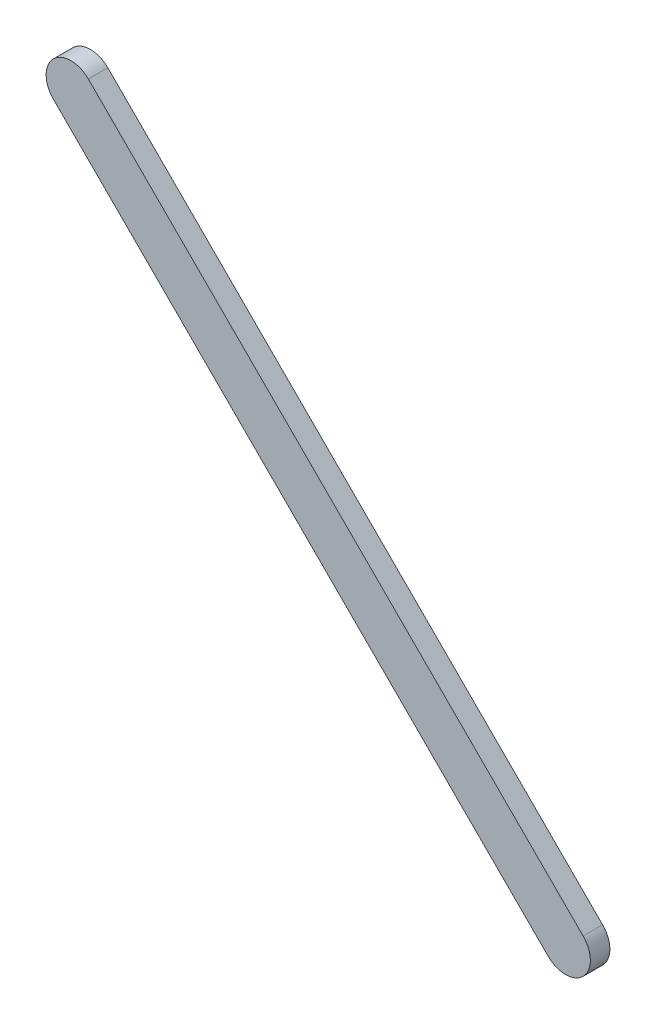
ISO-10303-21;
HEADER;
FILE_DESCRIPTION(('STEP AP214'),'2;1');
FILE_NAME('part.step','',(''),(''),'','','');
FILE_SCHEMA(('AUTOMOTIVE_DESIGN { 1 0 10303 214 1 1 1 1 }'));
ENDSEC;
DATA;
#1=APPLICATION_CONTEXT('core data for automotive mechanical design processes');
#2=APPLICATION_PROTOCOL_DEFINITION('international standard','automotive_design',2000,#1);
#3=PRODUCT_CONTEXT('',#1,'mechanical');
#4=PRODUCT('Part','Part','',(#3));
#5=PRODUCT_RELATED_PRODUCT_CATEGORY('part','',(#4));
#6=PRODUCT_DEFINITION_FORMATION('','',#4);
#7=PRODUCT_DEFINITION_CONTEXT('part definition',#1,'design');
#8=PRODUCT_DEFINITION('design','',#6,#7);
#9=PRODUCT_DEFINITION_SHAPE('','',#8);
#10=(LENGTH_UNIT() NAMED_UNIT(*) SI_UNIT(.MILLI.,.METRE.));
#11=(NAMED_UNIT(*) PLANE_ANGLE_UNIT() SI_UNIT($,.RADIAN.));
#12=(NAMED_UNIT(*) SI_UNIT($,.STERADIAN.) SOLID_ANGLE_UNIT());
#13=UNCERTAINTY_MEASURE_WITH_UNIT(LENGTH_MEASURE(1.E-05),#10,'distance_accuracy_value','');
#14=(GEOMETRIC_REPRESENTATION_CONTEXT(3) GLOBAL_UNCERTAINTY_ASSIGNED_CONTEXT((#13)) GLOBAL_UNIT_ASSIGNED_CONTEXT((#10,
#11,#12)) REPRESENTATION_CONTEXT('',''));
#15=CARTESIAN_POINT('',(0.,0.,0.));
#16=DIRECTION('',(0.,0.,1.));
#17=DIRECTION('',(1.,0.,0.));
#18=AXIS2_PLACEMENT_3D('',#15,#16,#17);
#19=CARTESIAN_POINT('',(129.58899406,118.7177966,0.));
#20=DIRECTION('',(0.707106781186546,0.70710678118655,0.));
#21=DIRECTION('',(0.70710678118655,-0.707106781186546,0.));
#22=AXIS2_PLACEMENT_3D('',#19,#20,#21);
#23=PLANE('',#22);
#24=DIRECTION('',(0.70710678118655,-0.707106781186546,0.));
#25=VECTOR('',#24,1.);
#26=CARTESIAN_POINT('',(129.58899406,118.7177966,0.1999996));
#27=LINE('',#26,#25);
#28=CARTESIAN_POINT('',(129.58899406,118.7177966,0.1999996));
#29=VERTEX_POINT('',#28);
#30=CARTESIAN_POINT('',(134.6689966,113.63779406,0.1999996));
#31=VERTEX_POINT('',#30);
#32=EDGE_CURVE('E11',#29,#31,#27,.T.);
#33=ORIENTED_EDGE('',*,*,#32,.F.);
#34=DIRECTION('',(0.,0.,1.));
#35=VECTOR('',#34,1.);
#36=CARTESIAN_POINT('',(129.58899406,118.7177966,0.));
#37=LINE('',#36,#35);
#38=CARTESIAN_POINT('',(129.58899406,118.7177966,0.));
#39=VERTEX_POINT('',#38);
#40=EDGE_CURVE('E24',#39,#29,#37,.T.);
#41=ORIENTED_EDGE('',*,*,#40,.F.);
#42=DIRECTION('',(0.70710678118655,-0.707106781186546,0.));
#43=VECTOR('',#42,1.);
#44=CARTESIAN_POINT('',(129.58899406,118.7177966,0.));
#45=LINE('',#44,#43);
#46=CARTESIAN_POINT('',(134.6689966,113.63779406,0.));
#47=VERTEX_POINT('',#46);
#48=EDGE_CURVE('E75',#39,#47,#45,.T.);
#49=ORIENTED_EDGE('',*,*,#48,.T.);
#50=DIRECTION('',(0.,0.,1.));
#51=VECTOR('',#50,1.);
#52=CARTESIAN_POINT('',(134.6689966,113.63779406,0.));
#53=LINE('',#52,#51);
#54=EDGE_CURVE('E37',#47,#31,#53,.T.);
#55=ORIENTED_EDGE('',*,*,#54,.T.);
#56=EDGE_LOOP('',(#33,#41,#49,#55));
#57=FACE_BOUND('',#56,.T.);
#58=ADVANCED_FACE('F17',(#57),#23,.F.);
#59=CARTESIAN_POINT('',(134.84860127,113.81739873,0.));
#60=DIRECTION('',(0.,0.,-1.));
#61=DIRECTION('',(-0.707106781186548,-0.707106781186548,0.));
#62=AXIS2_PLACEMENT_3D('',#59,#60,#61);
#63=CYLINDRICAL_SURFACE('',#62,0.253999360179536);
#64=CARTESIAN_POINT('',(134.84860127,113.81739873,0.1999996));
#65=DIRECTION('',(0.,0.,1.));
#66=DIRECTION('',(-0.707106781186548,-0.707106781186548,0.));
#67=AXIS2_PLACEMENT_3D('',#64,#65,#66);
#68=CIRCLE('',#67,0.253999360179536);
#69=CARTESIAN_POINT('',(135.02820594,113.9970034,0.1999996));
#70=VERTEX_POINT('',#69);
#71=EDGE_CURVE('E83',#31,#70,#68,.T.);
#72=ORIENTED_EDGE('',*,*,#71,.F.);
#73=ORIENTED_EDGE('',*,*,#54,.F.);
#74=CARTESIAN_POINT('',(134.84860127,113.81739873,0.));
#75=DIRECTION('',(0.,0.,1.));
#76=DIRECTION('',(-0.707106781186548,-0.707106781186548,0.));
#77=AXIS2_PLACEMENT_3D('',#74,#75,#76);
#78=CIRCLE('',#77,0.253999360179536);
#79=CARTESIAN_POINT('',(135.02820594,113.9970034,0.));
#80=VERTEX_POINT('',#79);
#81=EDGE_CURVE('E81',#47,#80,#78,.T.);
#82=ORIENTED_EDGE('',*,*,#81,.T.);
#83=DIRECTION('',(0.,0.,1.));
#84=VECTOR('',#83,1.);
#85=CARTESIAN_POINT('',(135.02820594,113.9970034,0.));
#86=LINE('',#85,#84);
#87=EDGE_CURVE('E67',#80,#70,#86,.T.);
#88=ORIENTED_EDGE('',*,*,#87,.T.);
#89=EDGE_LOOP('',(#72,#73,#82,#88));
#90=FACE_BOUND('',#89,.T.);
#91=ADVANCED_FACE('F89',(#90),#63,.T.);
#92=CARTESIAN_POINT('',(135.02820594,113.9970034,0.));
#93=DIRECTION('',(-0.707106781186549,-0.707106781186547,0.));
#94=DIRECTION('',(-0.707106781186547,0.707106781186549,0.));
#95=AXIS2_PLACEMENT_3D('',#92,#93,#94);
#96=PLANE('',#95);
#97=DIRECTION('',(-0.707106781186547,0.707106781186549,0.));
#98=VECTOR('',#97,1.);
#99=CARTESIAN_POINT('',(135.02820594,113.9970034,0.1999996));
#100=LINE('',#99,#98);
#101=CARTESIAN_POINT('',(129.9482034,119.07700594,0.1999996));
#102=VERTEX_POINT('',#101);
#103=EDGE_CURVE('E71',#70,#102,#100,.T.);
#104=ORIENTED_EDGE('',*,*,#103,.F.);
#105=ORIENTED_EDGE('',*,*,#87,.F.);
#106=DIRECTION('',(-0.707106781186547,0.707106781186549,0.));
#107=VECTOR('',#106,1.);
#108=CARTESIAN_POINT('',(135.02820594,113.9970034,0.));
#109=LINE('',#108,#107);
#110=CARTESIAN_POINT('',(129.9482034,119.07700594,0.));
#111=VERTEX_POINT('',#110);
#112=EDGE_CURVE('E63',#80,#111,#109,.T.);
#113=ORIENTED_EDGE('',*,*,#112,.T.);
#114=DIRECTION('',(0.,0.,1.));
#115=VECTOR('',#114,1.);
#116=CARTESIAN_POINT('',(129.9482034,119.07700594,0.));
#117=LINE('',#116,#115);
#118=EDGE_CURVE('E53',#111,#102,#117,.T.);
#119=ORIENTED_EDGE('',*,*,#118,.T.);
#120=EDGE_LOOP('',(#104,#105,#113,#119));
#121=FACE_BOUND('',#120,.T.);
#122=ADVANCED_FACE('F66',(#121),#96,.F.);
#123=CARTESIAN_POINT('',(129.76859873,118.89740127,0.));
#124=DIRECTION('',(0.,0.,-1.));
#125=DIRECTION('',(0.707106781186548,0.707106781186548,0.));
#126=AXIS2_PLACEMENT_3D('',#123,#124,#125);
#127=CYLINDRICAL_SURFACE('',#126,0.253999360179559);
#128=CARTESIAN_POINT('',(129.76859873,118.89740127,0.1999996));
#129=DIRECTION('',(0.,0.,1.));
#130=DIRECTION('',(0.707106781186548,0.707106781186548,0.));
#131=AXIS2_PLACEMENT_3D('',#128,#129,#130);
#132=CIRCLE('',#131,0.253999360179559);
#133=EDGE_CURVE('E59',#102,#29,#132,.T.);
#134=ORIENTED_EDGE('',*,*,#133,.F.);
#135=ORIENTED_EDGE('',*,*,#118,.F.);
#136=CARTESIAN_POINT('',(129.76859873,118.89740127,0.));
#137=DIRECTION('',(0.,0.,1.));
#138=DIRECTION('',(0.707106781186548,0.707106781186548,0.));
#139=AXIS2_PLACEMENT_3D('',#136,#137,#138);
#140=CIRCLE('',#139,0.253999360179559);
#141=EDGE_CURVE('E57',#111,#39,#140,.T.);
#142=ORIENTED_EDGE('',*,*,#141,.T.);
#143=ORIENTED_EDGE('',*,*,#40,.T.);
#144=EDGE_LOOP('',(#134,#135,#142,#143));
#145=FACE_BOUND('',#144,.T.);
#146=ADVANCED_FACE('F55',(#145),#127,.T.);
#147=CARTESIAN_POINT('',(129.58899406,118.7177966,0.));
#148=DIRECTION('',(0.,0.,-1.));
#149=DIRECTION('',(-1.,0.,0.));
#150=AXIS2_PLACEMENT_3D('',#147,#148,#149);
#151=PLANE('',#150);
#152=ORIENTED_EDGE('',*,*,#141,.F.);
#153=ORIENTED_EDGE('',*,*,#112,.F.);
#154=ORIENTED_EDGE('',*,*,#81,.F.);
#155=ORIENTED_EDGE('',*,*,#48,.F.);
#156=EDGE_LOOP('',(#152,#153,#154,#155));
#157=FACE_BOUND('',#156,.T.);
#158=ADVANCED_FACE('F74',(#157),#151,.T.);
#159=CARTESIAN_POINT('',(129.58899406,118.7177966,0.1999996));
#160=DIRECTION('',(0.,0.,-1.));
#161=DIRECTION('',(-1.,0.,0.));
#162=AXIS2_PLACEMENT_3D('',#159,#160,#161);
#163=PLANE('',#162);
#164=ORIENTED_EDGE('',*,*,#32,.T.);
#165=ORIENTED_EDGE('',*,*,#71,.T.);
#166=ORIENTED_EDGE('',*,*,#103,.T.);
#167=ORIENTED_EDGE('',*,*,#133,.T.);
#168=EDGE_LOOP('',(#164,#165,#166,#167));
#169=FACE_BOUND('',#168,.T.);
#170=ADVANCED_FACE('F91',(#169),#163,.F.);
#171=CLOSED_SHELL('',(#58,#91,#122,#146,#158,#170));
#172=MANIFOLD_SOLID_BREP('B1',#171);
#173=ADVANCED_BREP_SHAPE_REPRESENTATION('',(#18,#172),#14);
#174=SHAPE_DEFINITION_REPRESENTATION(#9,#173);
ENDSEC;
END-ISO-10303-21;
